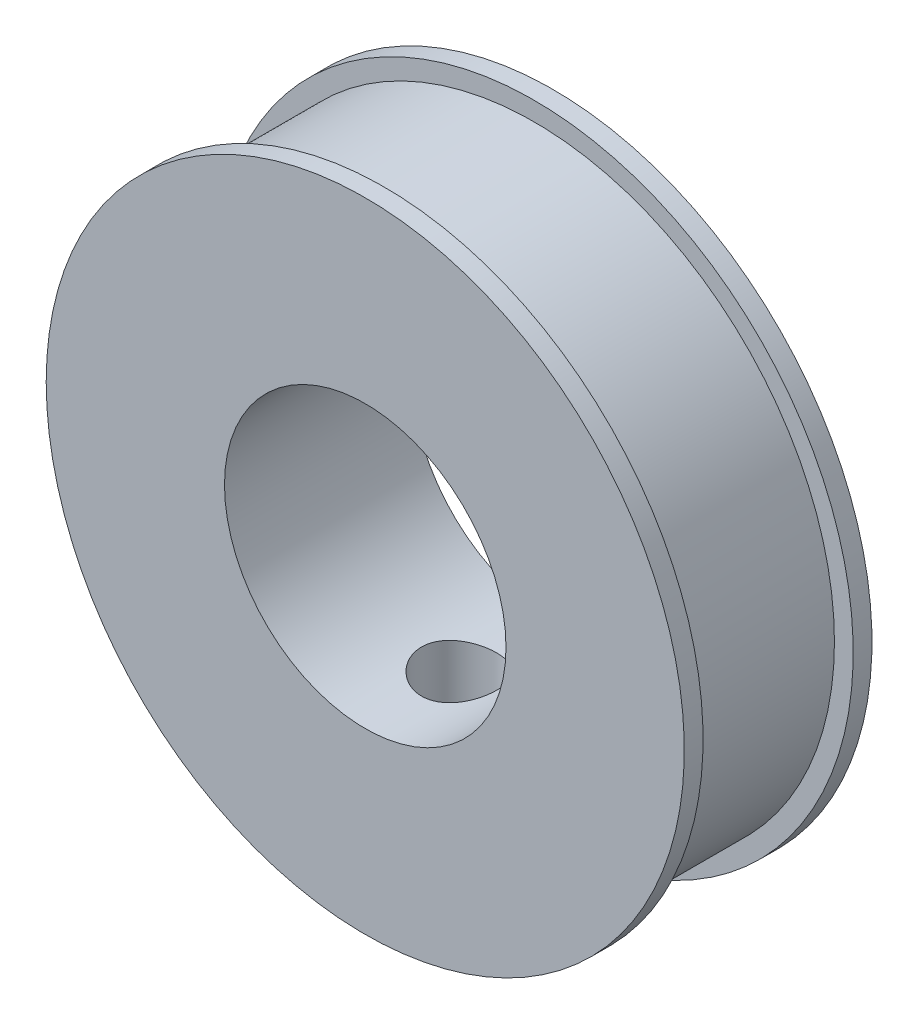
ISO-10303-21;
HEADER;
FILE_DESCRIPTION(('STEP AP214'),'2;1');
FILE_NAME('part.step','',(''),(''),'','','');
FILE_SCHEMA(('AUTOMOTIVE_DESIGN { 1 0 10303 214 1 1 1 1 }'));
ENDSEC;
DATA;
#1=APPLICATION_CONTEXT('core data for automotive mechanical design processes');
#2=APPLICATION_PROTOCOL_DEFINITION('international standard','automotive_design',2000,#1);
#3=PRODUCT_CONTEXT('',#1,'mechanical');
#4=PRODUCT('Part','Part','',(#3));
#5=PRODUCT_RELATED_PRODUCT_CATEGORY('part','',(#4));
#6=PRODUCT_DEFINITION_FORMATION('','',#4);
#7=PRODUCT_DEFINITION_CONTEXT('part definition',#1,'design');
#8=PRODUCT_DEFINITION('design','',#6,#7);
#9=PRODUCT_DEFINITION_SHAPE('','',#8);
#10=(LENGTH_UNIT() NAMED_UNIT(*) SI_UNIT(.MILLI.,.METRE.));
#11=(NAMED_UNIT(*) PLANE_ANGLE_UNIT() SI_UNIT($,.RADIAN.));
#12=(NAMED_UNIT(*) SI_UNIT($,.STERADIAN.) SOLID_ANGLE_UNIT());
#13=UNCERTAINTY_MEASURE_WITH_UNIT(LENGTH_MEASURE(1.E-05),#10,'distance_accuracy_value','');
#14=(GEOMETRIC_REPRESENTATION_CONTEXT(3) GLOBAL_UNCERTAINTY_ASSIGNED_CONTEXT((#13)) GLOBAL_UNIT_ASSIGNED_CONTEXT((#10,
#11,#12)) REPRESENTATION_CONTEXT('',''));
#15=CARTESIAN_POINT('',(0.,0.,0.));
#16=DIRECTION('',(0.,0.,1.));
#17=DIRECTION('',(1.,0.,0.));
#18=AXIS2_PLACEMENT_3D('',#15,#16,#17);
#19=CARTESIAN_POINT('',(0.,0.,0.));
#20=DIRECTION('',(0.,0.,-1.));
#21=DIRECTION('',(-1.,0.,0.));
#22=AXIS2_PLACEMENT_3D('',#19,#20,#21);
#23=PLANE('',#22);
#24=CARTESIAN_POINT('',(0.,0.,0.));
#25=DIRECTION('',(0.,0.,-1.));
#26=DIRECTION('',(-1.,0.,0.));
#27=AXIS2_PLACEMENT_3D('',#24,#25,#26);
#28=CIRCLE('',#27,7.5);
#29=CARTESIAN_POINT('',(-7.5,0.,0.));
#30=VERTEX_POINT('',#29);
#31=EDGE_CURVE('E68',#30,#30,#28,.T.);
#32=ORIENTED_EDGE('',*,*,#31,.T.);
#33=EDGE_LOOP('',(#32));
#34=FACE_BOUND('',#33,.T.);
#35=CARTESIAN_POINT('',(0.,0.,0.));
#36=DIRECTION('',(0.,0.,-1.));
#37=DIRECTION('',(-1.,0.,0.));
#38=AXIS2_PLACEMENT_3D('',#35,#36,#37);
#39=CIRCLE('',#38,17.);
#40=CARTESIAN_POINT('',(-17.,0.,0.));
#41=VERTEX_POINT('',#40);
#42=EDGE_CURVE('E10',#41,#41,#39,.T.);
#43=ORIENTED_EDGE('',*,*,#42,.F.);
#44=EDGE_LOOP('',(#43));
#45=FACE_BOUND('',#44,.T.);
#46=ADVANCED_FACE('F38',(#34,#45),#23,.F.);
#47=CARTESIAN_POINT('',(0.,0.,-10.));
#48=DIRECTION('',(0.,0.,-1.));
#49=DIRECTION('',(-1.,0.,0.));
#50=AXIS2_PLACEMENT_3D('',#47,#48,#49);
#51=CYLINDRICAL_SURFACE('',#50,17.);
#52=CARTESIAN_POINT('',(0.,0.,-0.999999999999999));
#53=DIRECTION('',(0.,0.,-1.));
#54=DIRECTION('',(-1.,0.,0.));
#55=AXIS2_PLACEMENT_3D('',#52,#53,#54);
#56=CIRCLE('',#55,17.);
#57=CARTESIAN_POINT('',(-17.,0.,-0.999999999999999));
#58=VERTEX_POINT('',#57);
#59=EDGE_CURVE('E50',#58,#58,#56,.T.);
#60=ORIENTED_EDGE('',*,*,#59,.F.);
#61=EDGE_LOOP('',(#60));
#62=FACE_BOUND('',#61,.T.);
#63=ORIENTED_EDGE('',*,*,#42,.T.);
#64=EDGE_LOOP('',(#63));
#65=FACE_BOUND('',#64,.T.);
#66=ADVANCED_FACE('F112',(#62,#65),#51,.T.);
#67=CARTESIAN_POINT('',(17.,0.,-1.));
#68=DIRECTION('',(0.,0.,1.));
#69=DIRECTION('',(1.,0.,0.));
#70=AXIS2_PLACEMENT_3D('',#67,#68,#69);
#71=PLANE('',#70);
#72=CARTESIAN_POINT('',(0.,0.,-0.999999999999999));
#73=DIRECTION('',(0.,0.,-1.));
#74=DIRECTION('',(-1.,0.,0.));
#75=AXIS2_PLACEMENT_3D('',#72,#73,#74);
#76=CIRCLE('',#75,16.);
#77=CARTESIAN_POINT('',(-16.,0.,-0.999999999999999));
#78=VERTEX_POINT('',#77);
#79=EDGE_CURVE('E54',#78,#78,#76,.T.);
#80=ORIENTED_EDGE('',*,*,#79,.F.);
#81=EDGE_LOOP('',(#80));
#82=FACE_BOUND('',#81,.T.);
#83=ORIENTED_EDGE('',*,*,#59,.T.);
#84=EDGE_LOOP('',(#83));
#85=FACE_BOUND('',#84,.T.);
#86=ADVANCED_FACE('F107',(#82,#85),#71,.F.);
#87=CARTESIAN_POINT('',(0.,0.,-10.));
#88=DIRECTION('',(0.,0.,-1.));
#89=DIRECTION('',(-1.,0.,0.));
#90=AXIS2_PLACEMENT_3D('',#87,#88,#89);
#91=CYLINDRICAL_SURFACE('',#90,16.);
#92=CARTESIAN_POINT('',(0.,-16.,-3.));
#93=CARTESIAN_POINT('',(0.111872876444609,-15.9999984391714,-3.00000475274858));
#94=CARTESIAN_POINT('',(0.223815659442198,-15.9988142764392,-3.00941830333543));
#95=CARTESIAN_POINT('',(0.444586241671802,-15.9942043208909,-3.04682220365664));
#96=CARTESIAN_POINT('',(0.553410664498996,-15.9907761875314,-3.07483195033871));
#97=CARTESIAN_POINT('',(0.764716459850443,-15.9820644883552,-3.14859011513127));
#98=CARTESIAN_POINT('',(0.86720204811691,-15.9767821716443,-3.19432659344788));
#99=CARTESIAN_POINT('',(1.06302357991443,-15.9649496070248,-3.30221382717584));
#100=CARTESIAN_POINT('',(1.1563610892451,-15.9583995766729,-3.36436176682457));
#101=CARTESIAN_POINT('',(1.33177025354505,-15.9447225704506,-3.50367355987167));
#102=CARTESIAN_POINT('',(1.4137842919497,-15.9375929175393,-3.58090970347699));
#103=CARTESIAN_POINT('',(1.56372223484599,-15.923581808078,-3.74805025882931));
#104=CARTESIAN_POINT('',(1.6316454211138,-15.9167003641941,-3.8379553159306));
#105=CARTESIAN_POINT('',(1.75168812902715,-15.9039384449567,-4.02825598205253));
#106=CARTESIAN_POINT('',(1.80375367675286,-15.8980614174233,-4.12868588925436));
#107=CARTESIAN_POINT('',(1.89025846126009,-15.8880090276615,-4.33694964155789));
#108=CARTESIAN_POINT('',(1.92469836645217,-15.8838336009051,-4.44478320571761));
#109=CARTESIAN_POINT('',(1.97479918401981,-15.8776827168289,-4.66419535646941));
#110=CARTESIAN_POINT('',(1.99055737178536,-15.875695867494,-4.77575140616336));
#111=CARTESIAN_POINT('',(2.00314843964578,-15.8741122251423,-4.99994101077747));
#112=CARTESIAN_POINT('',(1.99998208080193,-15.8745153360121,-5.11257452218503));
#113=CARTESIAN_POINT('',(1.97489378915832,-15.877655642958,-5.33504386179903));
#114=CARTESIAN_POINT('',(1.95307901038776,-15.8803795036826,-5.44489198896021));
#115=CARTESIAN_POINT('',(1.89148030654564,-15.887833598061,-5.65935601697519));
#116=CARTESIAN_POINT('',(1.85169601740152,-15.8925638723658,-5.76397181177123));
#117=CARTESIAN_POINT('',(1.75517244792932,-15.9035129269172,-5.96533439921735));
#118=CARTESIAN_POINT('',(1.69838660296611,-15.9097357856916,-6.06205864019919));
#119=CARTESIAN_POINT('',(1.56950517556554,-15.9229656914448,-6.2446453555306));
#120=CARTESIAN_POINT('',(1.49740889286462,-15.9299727742853,-6.33050733277894));
#121=CARTESIAN_POINT('',(1.33935928860302,-15.9440408791234,-6.48955416857819));
#122=CARTESIAN_POINT('',(1.25331360627201,-15.9511019390951,-6.56264727341278));
#123=CARTESIAN_POINT('',(1.07012573529114,-15.9644370604468,-6.69336710402444));
#124=CARTESIAN_POINT('',(0.972983521054603,-15.970711120012,-6.7509937941376));
#125=CARTESIAN_POINT('',(0.770289337090787,-15.9817692177486,-6.84914505637113));
#126=CARTESIAN_POINT('',(0.664734556270176,-15.9865527552123,-6.88966388310498));
#127=CARTESIAN_POINT('',(0.448246352344847,-15.9940862862405,-6.9523763948186));
#128=CARTESIAN_POINT('',(0.337313181304535,-15.996836375007,-6.97457093770964));
#129=CARTESIAN_POINT('',(0.114010531130799,-15.9999807712861,-6.99988593940844));
#130=CARTESIAN_POINT('',(0.00165559215888684,-16.0003906891411,-7.00313279389126));
#131=CARTESIAN_POINT('',(-0.221996829197996,-15.9988507040434,-6.99079381275524));
#132=CARTESIAN_POINT('',(-0.333294334051764,-15.9969008513457,-6.97520837819873));
#133=CARTESIAN_POINT('',(-0.551299606177216,-15.9908701500535,-6.92575223298049));
#134=CARTESIAN_POINT('',(-0.658021256339762,-15.9867963265109,-6.8919417892779));
#135=CARTESIAN_POINT('',(-0.864279723886723,-15.9769737848016,-6.80705803846967));
#136=CARTESIAN_POINT('',(-0.963816297172249,-15.971225009765,-6.75598414520686));
#137=CARTESIAN_POINT('',(-1.15344361654994,-15.9586545832809,-6.63771748999403));
#138=CARTESIAN_POINT('',(-1.24348300795505,-15.9518275523401,-6.57044296815549));
#139=CARTESIAN_POINT('',(-1.41103759170105,-15.9378811386052,-6.42180040197264));
#140=CARTESIAN_POINT('',(-1.48855228666948,-15.9307617442152,-6.34043179819921));
#141=CARTESIAN_POINT('',(-1.62930556705441,-15.9169848437007,-6.16535406659429));
#142=CARTESIAN_POINT('',(-1.69246036845435,-15.9103301977706,-6.07157732295169));
#143=CARTESIAN_POINT('',(-1.8021223115548,-15.8982832882972,-5.87467340411623));
#144=CARTESIAN_POINT('',(-1.84862978698269,-15.8928909994482,-5.77154641641879));
#145=CARTESIAN_POINT('',(-1.92354126309323,-15.883998803144,-5.55913974468191));
#146=CARTESIAN_POINT('',(-1.95199250196569,-15.8804939614783,-5.44987693596163));
#147=CARTESIAN_POINT('',(-1.99013599509428,-15.8757593272596,-5.22807801297547));
#148=CARTESIAN_POINT('',(-1.99982912202861,-15.8745294288702,-5.1155420512328));
#149=CARTESIAN_POINT('',(-2.00016522886787,-15.8744870158596,-4.89122485663626));
#150=CARTESIAN_POINT('',(-1.99093983815942,-15.8756577980156,-4.77944380133449));
#151=CARTESIAN_POINT('',(-1.95397952387946,-15.8802489162976,-4.55903429652394));
#152=CARTESIAN_POINT('',(-1.92624459832462,-15.8836692526646,-4.45040584735297));
#153=CARTESIAN_POINT('',(-1.85309365895173,-15.8923689261964,-4.23940243458688));
#154=CARTESIAN_POINT('',(-1.80768398477675,-15.8976475967423,-4.13702524398255));
#155=CARTESIAN_POINT('',(-1.70048552172025,-15.9094702659585,-3.94132267676135));
#156=CARTESIAN_POINT('',(-1.63869652760767,-15.9160142804833,-3.84799741358414));
#157=CARTESIAN_POINT('',(-1.50000506501267,-15.9296848380179,-3.67237501972762));
#158=CARTESIAN_POINT('',(-1.42300450061997,-15.9368149766723,-3.59015563123602));
#159=CARTESIAN_POINT('',(-1.25628018157471,-15.9508226527432,-3.43975453986562));
#160=CARTESIAN_POINT('',(-1.16655343131326,-15.9577001302047,-3.37157615138055));
#161=CARTESIAN_POINT('',(-0.976532496683369,-15.970456452694,-3.25097171431577));
#162=CARTESIAN_POINT('',(-0.876199423676936,-15.9763314006264,-3.1986065552806));
#163=CARTESIAN_POINT('',(-0.668146321841025,-15.9863811926138,-3.11154300566698));
#164=CARTESIAN_POINT('',(-0.56043446469619,-15.9905578829566,-3.07682541891723));
#165=CARTESIAN_POINT('',(-0.376804617574341,-15.995733762622,-3.03435252946296));
#166=CARTESIAN_POINT('',(-0.302044530813537,-15.9973258071636,-3.02148884641435));
#167=CARTESIAN_POINT('',(-0.151533650569948,-15.9994594506335,-3.00431100344542));
#168=CARTESIAN_POINT('',(-0.0757828643968217,-16.0000010573078,-2.99999678048056));
#169=CARTESIAN_POINT('',(0.,-16.,-3.));
#170=B_SPLINE_CURVE_WITH_KNOTS('',3,(#92,#93,#94,#95,#96,#97,#98,#99,#100,#101,#102,#103,#104,
#105,#106,#107,#108,#109,#110,#111,#112,#113,#114,#115,#116,#117,#118,#119,#120,#121,#122,#123,
#124,#125,#126,#127,#128,#129,#130,#131,#132,#133,#134,#135,#136,#137,#138,#139,#140,#141,#142,
#143,#144,#145,#146,#147,#148,#149,#150,#151,#152,#153,#154,#155,#156,#157,#158,#159,#160,#161,
#162,#163,#164,#165,#166,#167,#168,#169),.UNSPECIFIED.,.T.,.F.,(4,2,2,2,2,2,2,2,2,2,2,2,2,2,2,2,
2,2,2,2,2,2,2,2,2,2,2,2,2,2,2,2,2,2,2,2,2,2,4),(0.,0.335341818220998,0.671033968754741,
1.00650040654542,1.34190932472858,1.67896650561474,2.01604086240008,2.35425000255095,
2.69244631597445,3.02887380229057,3.36528775907731,3.69978157153353,4.03428216132993,
4.36970741028427,4.70514800410911,5.04290782509133,5.3806684249049,5.71854236585284,
6.05640048723024,6.39200223513537,6.72759683601543,7.06208843114716,7.39659138463158,
7.73281922342737,8.0690604110007,8.40721577206059,8.74536435377231,9.0826245942474,
9.41986914408498,9.75477520961771,10.0896813110364,10.4244673976519,10.7592576792981,
11.0962819015346,11.4333855877601,11.7717712242948,12.1097879894723,12.336950745501,
12.5641118264035),.UNSPECIFIED.);
#171=CARTESIAN_POINT('',(0.,-16.,-3.));
#172=VERTEX_POINT('',#171);
#173=EDGE_CURVE('E72',#172,#172,#170,.T.);
#174=ORIENTED_EDGE('',*,*,#173,.T.);
#175=EDGE_LOOP('',(#174));
#176=FACE_BOUND('',#175,.T.);
#177=CARTESIAN_POINT('',(0.,0.,-9.));
#178=DIRECTION('',(0.,0.,-1.));
#179=DIRECTION('',(-1.,0.,0.));
#180=AXIS2_PLACEMENT_3D('',#177,#178,#179);
#181=CIRCLE('',#180,16.);
#182=CARTESIAN_POINT('',(-16.,0.,-9.));
#183=VERTEX_POINT('',#182);
#184=EDGE_CURVE('E59',#183,#183,#181,.T.);
#185=ORIENTED_EDGE('',*,*,#184,.F.);
#186=EDGE_LOOP('',(#185));
#187=FACE_BOUND('',#186,.T.);
#188=ORIENTED_EDGE('',*,*,#79,.T.);
#189=EDGE_LOOP('',(#188));
#190=FACE_BOUND('',#189,.T.);
#191=ADVANCED_FACE('F80',(#176,#187,#190),#91,.T.);
#192=CARTESIAN_POINT('',(16.,0.,-9.));
#193=DIRECTION('',(0.,0.,-1.));
#194=DIRECTION('',(-1.,0.,0.));
#195=AXIS2_PLACEMENT_3D('',#192,#193,#194);
#196=PLANE('',#195);
#197=CARTESIAN_POINT('',(0.,0.,-9.));
#198=DIRECTION('',(0.,0.,-1.));
#199=DIRECTION('',(-1.,0.,0.));
#200=AXIS2_PLACEMENT_3D('',#197,#198,#199);
#201=CIRCLE('',#200,17.);
#202=CARTESIAN_POINT('',(-17.,0.,-9.));
#203=VERTEX_POINT('',#202);
#204=EDGE_CURVE('E62',#203,#203,#201,.T.);
#205=ORIENTED_EDGE('',*,*,#204,.F.);
#206=EDGE_LOOP('',(#205));
#207=FACE_BOUND('',#206,.T.);
#208=ORIENTED_EDGE('',*,*,#184,.T.);
#209=EDGE_LOOP('',(#208));
#210=FACE_BOUND('',#209,.T.);
#211=ADVANCED_FACE('F100',(#207,#210),#196,.F.);
#212=CARTESIAN_POINT('',(0.,0.,-10.));
#213=DIRECTION('',(0.,0.,-1.));
#214=DIRECTION('',(-1.,0.,0.));
#215=AXIS2_PLACEMENT_3D('',#212,#213,#214);
#216=CYLINDRICAL_SURFACE('',#215,17.);
#217=CARTESIAN_POINT('',(0.,0.,-10.));
#218=DIRECTION('',(0.,0.,-1.));
#219=DIRECTION('',(-1.,0.,0.));
#220=AXIS2_PLACEMENT_3D('',#217,#218,#219);
#221=CIRCLE('',#220,17.);
#222=CARTESIAN_POINT('',(-17.,0.,-10.));
#223=VERTEX_POINT('',#222);
#224=EDGE_CURVE('E65',#223,#223,#221,.T.);
#225=ORIENTED_EDGE('',*,*,#224,.F.);
#226=EDGE_LOOP('',(#225));
#227=FACE_BOUND('',#226,.T.);
#228=ORIENTED_EDGE('',*,*,#204,.T.);
#229=EDGE_LOOP('',(#228));
#230=FACE_BOUND('',#229,.T.);
#231=ADVANCED_FACE('F97',(#227,#230),#216,.T.);
#232=CARTESIAN_POINT('',(17.,0.,-10.));
#233=DIRECTION('',(0.,0.,1.));
#234=DIRECTION('',(1.,0.,0.));
#235=AXIS2_PLACEMENT_3D('',#232,#233,#234);
#236=PLANE('',#235);
#237=CARTESIAN_POINT('',(0.,0.,-10.));
#238=DIRECTION('',(0.,0.,-1.));
#239=DIRECTION('',(-1.,0.,0.));
#240=AXIS2_PLACEMENT_3D('',#237,#238,#239);
#241=CIRCLE('',#240,7.5);
#242=CARTESIAN_POINT('',(-7.5,0.,-10.));
#243=VERTEX_POINT('',#242);
#244=EDGE_CURVE('E69',#243,#243,#241,.T.);
#245=ORIENTED_EDGE('',*,*,#244,.F.);
#246=EDGE_LOOP('',(#245));
#247=FACE_BOUND('',#246,.T.);
#248=ORIENTED_EDGE('',*,*,#224,.T.);
#249=EDGE_LOOP('',(#248));
#250=FACE_BOUND('',#249,.T.);
#251=ADVANCED_FACE('F93',(#247,#250),#236,.F.);
#252=CARTESIAN_POINT('',(0.,0.,0.));
#253=DIRECTION('',(0.,0.,-1.));
#254=DIRECTION('',(-1.,0.,0.));
#255=AXIS2_PLACEMENT_3D('',#252,#253,#254);
#256=CYLINDRICAL_SURFACE('',#255,7.5);
#257=CARTESIAN_POINT('',(0.,-7.5,-3.));
#258=CARTESIAN_POINT('',(-0.110254555832854,-7.49999833810161,-3.00000261693485));
#259=CARTESIAN_POINT('',(-0.22053716022184,-7.49754486162151,-3.00914761418967));
#260=CARTESIAN_POINT('',(-0.437925451354463,-7.48799573621659,-3.0454212307387));
#261=CARTESIAN_POINT('',(-0.545029583319086,-7.48089785332586,-3.07255850442612));
#262=CARTESIAN_POINT('',(-0.752891589045312,-7.4628433325279,-3.14387166686403));
#263=CARTESIAN_POINT('',(-0.853657451015284,-7.45189167130375,-3.18802558766602));
#264=CARTESIAN_POINT('',(-1.04635368639266,-7.42728699151678,-3.29203724266662));
#265=CARTESIAN_POINT('',(-1.13828347044963,-7.4136337929518,-3.35189602335929));
#266=CARTESIAN_POINT('',(-1.31282950374002,-7.38474614901995,-3.48708351641337));
#267=CARTESIAN_POINT('',(-1.39521168986279,-7.36948467678681,-3.56270866800827));
#268=CARTESIAN_POINT('',(-1.54628713660638,-7.33927409679591,-3.72664848306336));
#269=CARTESIAN_POINT('',(-1.61497863495664,-7.32432502947243,-3.81496477761753));
#270=CARTESIAN_POINT('',(-1.73786409243415,-7.29615537464372,-4.00364823482545));
#271=CARTESIAN_POINT('',(-1.79178877736487,-7.28296888563239,-4.10419632826173));
#272=CARTESIAN_POINT('',(-1.88187548076994,-7.26021477318187,-4.31334011109243));
#273=CARTESIAN_POINT('',(-1.91804077451369,-7.25064648253265,-4.42193431233144));
#274=CARTESIAN_POINT('',(-1.97076920226504,-7.23649115802399,-4.64149553782501));
#275=CARTESIAN_POINT('',(-1.98775670244692,-7.2317964781149,-4.75235353993074));
#276=CARTESIAN_POINT('',(-2.0029703470582,-7.2275983091637,-4.97543768330654));
#277=CARTESIAN_POINT('',(-2.00119999705753,-7.22809385014446,-5.08766356502407));
#278=CARTESIAN_POINT('',(-1.97928510002699,-7.2341237880203,-5.30698541537406));
#279=CARTESIAN_POINT('',(-1.95965406064765,-7.23951735511531,-5.41413718203849));
#280=CARTESIAN_POINT('',(-1.90339748722183,-7.25451013080688,-5.62356833445624));
#281=CARTESIAN_POINT('',(-1.86677059492995,-7.26410967552612,-5.72584733007535));
#282=CARTESIAN_POINT('',(-1.77714356965256,-7.28655661748386,-5.92396814380858));
#283=CARTESIAN_POINT('',(-1.72396341137784,-7.29943942818703,-6.01972433928626));
#284=CARTESIAN_POINT('',(-1.60286503823778,-7.32698229642445,-6.20113415885153));
#285=CARTESIAN_POINT('',(-1.53494392224251,-7.34164270355186,-6.28678578915647));
#286=CARTESIAN_POINT('',(-1.38366607263419,-7.37167510629864,-6.4484889974548));
#287=CARTESIAN_POINT('',(-1.29987812728299,-7.38705471488831,-6.52413631831495));
#288=CARTESIAN_POINT('',(-1.12061766820637,-7.41636381276316,-6.66038878035029));
#289=CARTESIAN_POINT('',(-1.02514469420509,-7.43029324488555,-6.72099332870243));
#290=CARTESIAN_POINT('',(-0.824598255497452,-7.45521820398293,-6.82561790282465));
#291=CARTESIAN_POINT('',(-0.71948490255179,-7.4662007283356,-6.86956477044859));
#292=CARTESIAN_POINT('',(-0.503002294390396,-7.48390044400999,-6.93904718881337));
#293=CARTESIAN_POINT('',(-0.391634411928324,-7.49061856733749,-6.96458676272396));
#294=CARTESIAN_POINT('',(-0.169254083145516,-7.49889158558384,-6.99589487691783));
#295=CARTESIAN_POINT('',(-0.0583242376413806,-7.50058997470959,-7.00221303985087));
#296=CARTESIAN_POINT('',(0.163010045901198,-7.49904471691695,-6.99641683575306));
#297=CARTESIAN_POINT('',(0.273414537062113,-7.49580158080353,-6.98430437389423));
#298=CARTESIAN_POINT('',(0.488602449901779,-7.48483035496021,-6.94244155254003));
#299=CARTESIAN_POINT('',(0.593449852027782,-7.47718026546329,-6.91299775380224));
#300=CARTESIAN_POINT('',(0.796706971176064,-7.45826294894139,-6.83766405549205));
#301=CARTESIAN_POINT('',(0.895115989216027,-7.44699532996161,-6.79177237374946));
#302=CARTESIAN_POINT('',(1.08483847466795,-7.42175660559528,-6.68382611281946));
#303=CARTESIAN_POINT('',(1.17597518846118,-7.40773686604957,-6.62147253320226));
#304=CARTESIAN_POINT('',(1.34668463539715,-7.37861452365564,-6.48274836984201));
#305=CARTESIAN_POINT('',(1.42625507879918,-7.3635117072752,-6.40637501739895));
#306=CARTESIAN_POINT('',(1.57388924478774,-7.33339745866705,-6.23921442250544));
#307=CARTESIAN_POINT('',(1.64156519249816,-7.31840061429312,-6.14808143860483));
#308=CARTESIAN_POINT('',(1.76067191185118,-7.29066447182728,-5.95543530390038));
#309=CARTESIAN_POINT('',(1.81210336122161,-7.27792507956316,-5.8539225863777));
#310=CARTESIAN_POINT('',(1.89687411586112,-7.2562926837321,-5.6439046929239));
#311=CARTESIAN_POINT('',(1.93031812253957,-7.24737748318009,-5.53544418818243));
#312=CARTESIAN_POINT('',(1.97841205118791,-7.23439825126801,-5.31416068032525));
#313=CARTESIAN_POINT('',(1.99306677602478,-7.23033298020014,-5.20133879965209));
#314=CARTESIAN_POINT('',(2.00288989653714,-7.22761744573589,-4.97850521211621));
#315=CARTESIAN_POINT('',(1.99868155618109,-7.22879397743239,-4.86852267974172));
#316=CARTESIAN_POINT('',(1.97234376000439,-7.23602396081087,-4.65089648598997));
#317=CARTESIAN_POINT('',(1.95021476535025,-7.24207728699439,-4.54325276449943));
#318=CARTESIAN_POINT('',(1.88902515699699,-7.25827571073158,-4.33414424787016));
#319=CARTESIAN_POINT('',(1.8500966107558,-7.26838885019644,-4.23263815726782));
#320=CARTESIAN_POINT('',(1.75651554562386,-7.29156818136177,-4.03752116946586));
#321=CARTESIAN_POINT('',(1.70186056024617,-7.30463483621364,-3.94391151369951));
#322=CARTESIAN_POINT('',(1.57648909268817,-7.3327292144046,-3.76426964050339));
#323=CARTESIAN_POINT('',(1.50534729767909,-7.3478033310169,-3.67854146502379));
#324=CARTESIAN_POINT('',(1.349830535111,-7.37795503783007,-3.52003754833267));
#325=CARTESIAN_POINT('',(1.26545235435875,-7.39303262798441,-3.44726496133116));
#326=CARTESIAN_POINT('',(1.08367998108868,-7.42187812403968,-3.31520776235314));
#327=CARTESIAN_POINT('',(0.986045961751778,-7.43561111314551,-3.25624498935067));
#328=CARTESIAN_POINT('',(0.781888640416888,-7.45983810102897,-3.15566258407064));
#329=CARTESIAN_POINT('',(0.675371094696297,-7.47033417683594,-3.1140318243364));
#330=CARTESIAN_POINT('',(0.474374704880991,-7.48554752513468,-3.05472471458448));
#331=CARTESIAN_POINT('',(0.380762016565035,-7.49092770592602,-3.0342506164075));
#332=CARTESIAN_POINT('',(0.191439795317076,-7.49815449036456,-3.00688779383294));
#333=CARTESIAN_POINT('',(0.09573047040486,-7.5000014429727,-2.99999772779998));
#334=CARTESIAN_POINT('',(0.,-7.5,-3.));
#335=B_SPLINE_CURVE_WITH_KNOTS('',3,(#257,#258,#259,#260,#261,#262,#263,#264,#265,#266,#267,
#268,#269,#270,#271,#272,#273,#274,#275,#276,#277,#278,#279,#280,#281,#282,#283,#284,#285,#286,
#287,#288,#289,#290,#291,#292,#293,#294,#295,#296,#297,#298,#299,#300,#301,#302,#303,#304,#305,
#306,#307,#308,#309,#310,#311,#312,#313,#314,#315,#316,#317,#318,#319,#320,#321,#322,#323,#324,
#325,#326,#327,#328,#329,#330,#331,#332,#333,#334),.UNSPECIFIED.,.T.,.F.,(4,2,2,2,2,2,2,2,2,2,2,
2,2,2,2,2,2,2,2,2,2,2,2,2,2,2,2,2,2,2,2,2,2,2,2,2,2,2,4),(0.,0.330412598949569,0.66098424376145,
0.991130552971932,1.32129886708675,1.65834897954967,1.99544244925149,2.33832582523229,
2.681145941297,3.01622158250468,3.3512346040432,3.67691002045997,4.00261146812939,
4.33198673346498,4.6614268811763,5.00161259812322,5.34181171937597,5.68348809603041,
6.02508977190139,6.35682717524547,6.6885302892535,7.01453535642116,7.34057575775614,
7.6730028600455,8.00549568258887,8.34736496382788,8.68921998024107,9.02906297699386,
9.36881908663982,9.69743342403611,10.0260393052059,10.352107654483,10.67822717123,
11.0139433957139,11.3497412433245,11.692722522809,12.0354832614518,12.3223981899334,
12.6092847796638),.UNSPECIFIED.);
#336=CARTESIAN_POINT('',(0.,-7.5,-3.));
#337=VERTEX_POINT('',#336);
#338=EDGE_CURVE('E41',#337,#337,#335,.T.);
#339=ORIENTED_EDGE('',*,*,#338,.T.);
#340=EDGE_LOOP('',(#339));
#341=FACE_BOUND('',#340,.T.);
#342=ORIENTED_EDGE('',*,*,#31,.F.);
#343=EDGE_LOOP('',(#342));
#344=FACE_BOUND('',#343,.T.);
#345=ORIENTED_EDGE('',*,*,#244,.T.);
#346=EDGE_LOOP('',(#345));
#347=FACE_BOUND('',#346,.T.);
#348=ADVANCED_FACE('F87',(#341,#344,#347),#256,.F.);
#349=CARTESIAN_POINT('',(0.,-27.,-5.));
#350=DIRECTION('',(0.,1.,0.));
#351=DIRECTION('',(0.,0.,1.));
#352=AXIS2_PLACEMENT_3D('',#349,#350,#351);
#353=CYLINDRICAL_SURFACE('',#352,2.);
#354=ORIENTED_EDGE('',*,*,#338,.F.);
#355=EDGE_LOOP('',(#354));
#356=FACE_BOUND('',#355,.T.);
#357=ORIENTED_EDGE('',*,*,#173,.F.);
#358=EDGE_LOOP('',(#357));
#359=FACE_BOUND('',#358,.T.);
#360=ADVANCED_FACE('F84',(#356,#359),#353,.F.);
#361=CLOSED_SHELL('',(#46,#66,#86,#191,#211,#231,#251,#348,#360));
#362=MANIFOLD_SOLID_BREP('B2',#361);
#363=ADVANCED_BREP_SHAPE_REPRESENTATION('',(#18,#362),#14);
#364=SHAPE_DEFINITION_REPRESENTATION(#9,#363);
ENDSEC;
END-ISO-10303-21;
